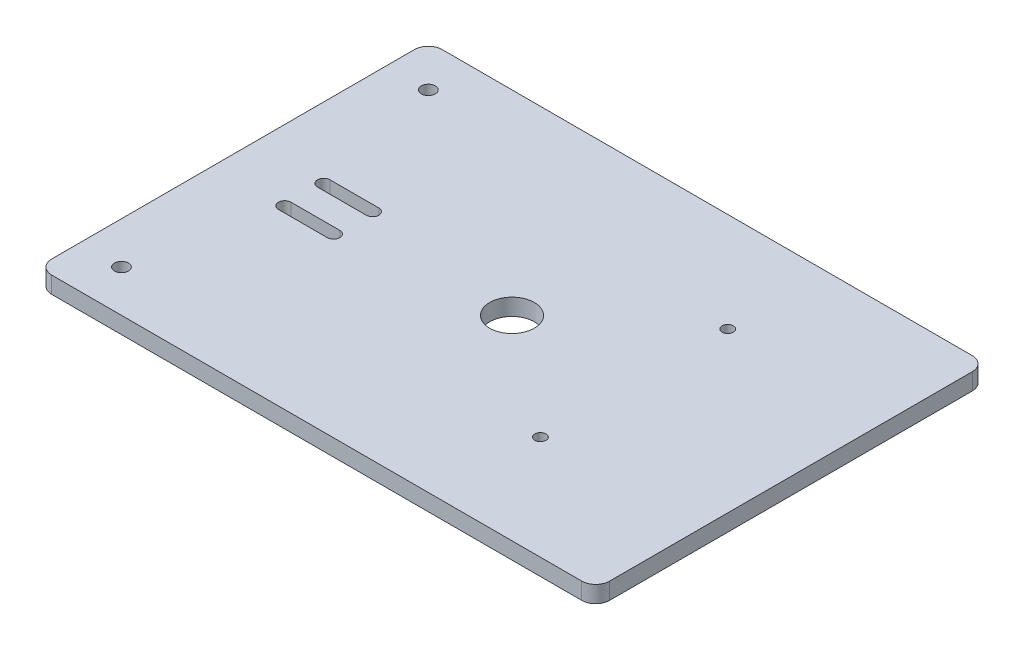
ISO-10303-21;
HEADER;
FILE_DESCRIPTION(('STEP AP214'),'2;1');
FILE_NAME('part.step','',(''),(''),'','','');
FILE_SCHEMA(('AUTOMOTIVE_DESIGN { 1 0 10303 214 1 1 1 1 }'));
ENDSEC;
DATA;
#1=APPLICATION_CONTEXT('core data for automotive mechanical design processes');
#2=APPLICATION_PROTOCOL_DEFINITION('international standard','automotive_design',2000,#1);
#3=PRODUCT_CONTEXT('',#1,'mechanical');
#4=PRODUCT('Part','Part','',(#3));
#5=PRODUCT_RELATED_PRODUCT_CATEGORY('part','',(#4));
#6=PRODUCT_DEFINITION_FORMATION('','',#4);
#7=PRODUCT_DEFINITION_CONTEXT('part definition',#1,'design');
#8=PRODUCT_DEFINITION('design','',#6,#7);
#9=PRODUCT_DEFINITION_SHAPE('','',#8);
#10=(LENGTH_UNIT() NAMED_UNIT(*) SI_UNIT(.MILLI.,.METRE.));
#11=(NAMED_UNIT(*) PLANE_ANGLE_UNIT() SI_UNIT($,.RADIAN.));
#12=(NAMED_UNIT(*) SI_UNIT($,.STERADIAN.) SOLID_ANGLE_UNIT());
#13=UNCERTAINTY_MEASURE_WITH_UNIT(LENGTH_MEASURE(1.E-05),#10,'distance_accuracy_value','');
#14=(GEOMETRIC_REPRESENTATION_CONTEXT(3) GLOBAL_UNCERTAINTY_ASSIGNED_CONTEXT((#13)) GLOBAL_UNIT_ASSIGNED_CONTEXT((#10,
#11,#12)) REPRESENTATION_CONTEXT('',''));
#15=CARTESIAN_POINT('',(0.,0.,0.));
#16=DIRECTION('',(0.,0.,1.));
#17=DIRECTION('',(1.,0.,0.));
#18=AXIS2_PLACEMENT_3D('',#15,#16,#17);
#19=CARTESIAN_POINT('',(100.,6.,-70.));
#20=DIRECTION('',(-1.,0.,0.));
#21=DIRECTION('',(0.,0.,1.));
#22=AXIS2_PLACEMENT_3D('',#19,#20,#21);
#23=PLANE('',#22);
#24=DIRECTION('',(0.,0.,-1.));
#25=VECTOR('',#24,1.);
#26=CARTESIAN_POINT('',(100.,0.,-70.));
#27=LINE('',#26,#25);
#28=CARTESIAN_POINT('',(100.,0.,65.));
#29=VERTEX_POINT('',#28);
#30=CARTESIAN_POINT('',(100.,0.,-65.));
#31=VERTEX_POINT('',#30);
#32=EDGE_CURVE('E234',#29,#31,#27,.T.);
#33=ORIENTED_EDGE('',*,*,#32,.T.);
#34=DIRECTION('',(0.,-1.,0.));
#35=VECTOR('',#34,1.);
#36=CARTESIAN_POINT('',(100.,6.,-65.));
#37=LINE('',#36,#35);
#38=CARTESIAN_POINT('',(100.,6.,-65.));
#39=VERTEX_POINT('',#38);
#40=EDGE_CURVE('E11',#31,#39,#37,.F.);
#41=ORIENTED_EDGE('',*,*,#40,.T.);
#42=DIRECTION('',(0.,0.,-1.));
#43=VECTOR('',#42,1.);
#44=CARTESIAN_POINT('',(100.,6.,-70.));
#45=LINE('',#44,#43);
#46=CARTESIAN_POINT('',(100.,6.,65.));
#47=VERTEX_POINT('',#46);
#48=EDGE_CURVE('E243',#47,#39,#45,.T.);
#49=ORIENTED_EDGE('',*,*,#48,.F.);
#50=DIRECTION('',(0.,-1.,0.));
#51=VECTOR('',#50,1.);
#52=CARTESIAN_POINT('',(100.,6.,65.));
#53=LINE('',#52,#51);
#54=EDGE_CURVE('E47',#47,#29,#53,.T.);
#55=ORIENTED_EDGE('',*,*,#54,.T.);
#56=EDGE_LOOP('',(#33,#41,#49,#55));
#57=FACE_BOUND('',#56,.T.);
#58=ADVANCED_FACE('F39',(#57),#23,.F.);
#59=CARTESIAN_POINT('',(-100.,6.,-70.));
#60=DIRECTION('',(0.,0.,1.));
#61=DIRECTION('',(1.,0.,0.));
#62=AXIS2_PLACEMENT_3D('',#59,#60,#61);
#63=PLANE('',#62);
#64=DIRECTION('',(-1.,0.,0.));
#65=VECTOR('',#64,1.);
#66=CARTESIAN_POINT('',(-100.,0.,-70.));
#67=LINE('',#66,#65);
#68=CARTESIAN_POINT('',(95.,0.,-70.));
#69=VERTEX_POINT('',#68);
#70=CARTESIAN_POINT('',(-95.,0.,-70.));
#71=VERTEX_POINT('',#70);
#72=EDGE_CURVE('E259',#69,#71,#67,.T.);
#73=ORIENTED_EDGE('',*,*,#72,.T.);
#74=DIRECTION('',(0.,-1.,0.));
#75=VECTOR('',#74,1.);
#76=CARTESIAN_POINT('',(-95.,6.,-70.));
#77=LINE('',#76,#75);
#78=CARTESIAN_POINT('',(-95.,6.,-70.));
#79=VERTEX_POINT('',#78);
#80=EDGE_CURVE('E282',#71,#79,#77,.F.);
#81=ORIENTED_EDGE('',*,*,#80,.T.);
#82=DIRECTION('',(-1.,0.,0.));
#83=VECTOR('',#82,1.);
#84=CARTESIAN_POINT('',(-100.,6.,-70.));
#85=LINE('',#84,#83);
#86=CARTESIAN_POINT('',(95.,6.,-70.));
#87=VERTEX_POINT('',#86);
#88=EDGE_CURVE('E246',#87,#79,#85,.T.);
#89=ORIENTED_EDGE('',*,*,#88,.F.);
#90=DIRECTION('',(0.,-1.,0.));
#91=VECTOR('',#90,1.);
#92=CARTESIAN_POINT('',(95.,6.,-70.));
#93=LINE('',#92,#91);
#94=EDGE_CURVE('E279',#87,#69,#93,.T.);
#95=ORIENTED_EDGE('',*,*,#94,.T.);
#96=EDGE_LOOP('',(#73,#81,#89,#95));
#97=FACE_BOUND('',#96,.T.);
#98=ADVANCED_FACE('F314',(#97),#63,.F.);
#99=CARTESIAN_POINT('',(-100.,6.,-70.));
#100=DIRECTION('',(1.,0.,0.));
#101=DIRECTION('',(0.,0.,-1.));
#102=AXIS2_PLACEMENT_3D('',#99,#100,#101);
#103=PLANE('',#102);
#104=DIRECTION('',(0.,0.,1.));
#105=VECTOR('',#104,1.);
#106=CARTESIAN_POINT('',(-100.,6.,-70.));
#107=LINE('',#106,#105);
#108=CARTESIAN_POINT('',(-100.,6.,-65.));
#109=VERTEX_POINT('',#108);
#110=CARTESIAN_POINT('',(-100.,6.,65.));
#111=VERTEX_POINT('',#110);
#112=EDGE_CURVE('E250',#109,#111,#107,.T.);
#113=ORIENTED_EDGE('',*,*,#112,.F.);
#114=DIRECTION('',(0.,-1.,0.));
#115=VECTOR('',#114,1.);
#116=CARTESIAN_POINT('',(-100.,6.,-65.));
#117=LINE('',#116,#115);
#118=CARTESIAN_POINT('',(-100.,0.,-65.));
#119=VERTEX_POINT('',#118);
#120=EDGE_CURVE('E268',#109,#119,#117,.T.);
#121=ORIENTED_EDGE('',*,*,#120,.T.);
#122=DIRECTION('',(0.,0.,1.));
#123=VECTOR('',#122,1.);
#124=CARTESIAN_POINT('',(-100.,0.,-70.));
#125=LINE('',#124,#123);
#126=CARTESIAN_POINT('',(-100.,0.,65.));
#127=VERTEX_POINT('',#126);
#128=EDGE_CURVE('E262',#119,#127,#125,.T.);
#129=ORIENTED_EDGE('',*,*,#128,.T.);
#130=DIRECTION('',(0.,-1.,0.));
#131=VECTOR('',#130,1.);
#132=CARTESIAN_POINT('',(-100.,6.,65.));
#133=LINE('',#132,#131);
#134=EDGE_CURVE('E256',#127,#111,#133,.F.);
#135=ORIENTED_EDGE('',*,*,#134,.T.);
#136=EDGE_LOOP('',(#113,#121,#129,#135));
#137=FACE_BOUND('',#136,.T.);
#138=ADVANCED_FACE('F324',(#137),#103,.F.);
#139=CARTESIAN_POINT('',(-100.,6.,70.));
#140=DIRECTION('',(0.,0.,-1.));
#141=DIRECTION('',(-1.,0.,0.));
#142=AXIS2_PLACEMENT_3D('',#139,#140,#141);
#143=PLANE('',#142);
#144=DIRECTION('',(1.,0.,0.));
#145=VECTOR('',#144,1.);
#146=CARTESIAN_POINT('',(-100.,6.,70.));
#147=LINE('',#146,#145);
#148=CARTESIAN_POINT('',(-95.,6.,70.));
#149=VERTEX_POINT('',#148);
#150=CARTESIAN_POINT('',(95.,6.,70.));
#151=VERTEX_POINT('',#150);
#152=EDGE_CURVE('E253',#149,#151,#147,.T.);
#153=ORIENTED_EDGE('',*,*,#152,.F.);
#154=DIRECTION('',(0.,-1.,0.));
#155=VECTOR('',#154,1.);
#156=CARTESIAN_POINT('',(-95.,6.,70.));
#157=LINE('',#156,#155);
#158=CARTESIAN_POINT('',(-95.,0.,70.));
#159=VERTEX_POINT('',#158);
#160=EDGE_CURVE('E294',#149,#159,#157,.T.);
#161=ORIENTED_EDGE('',*,*,#160,.T.);
#162=DIRECTION('',(1.,0.,0.));
#163=VECTOR('',#162,1.);
#164=CARTESIAN_POINT('',(-100.,0.,70.));
#165=LINE('',#164,#163);
#166=CARTESIAN_POINT('',(95.,0.,70.));
#167=VERTEX_POINT('',#166);
#168=EDGE_CURVE('E247',#159,#167,#165,.T.);
#169=ORIENTED_EDGE('',*,*,#168,.T.);
#170=DIRECTION('',(0.,-1.,0.));
#171=VECTOR('',#170,1.);
#172=CARTESIAN_POINT('',(95.,6.,70.));
#173=LINE('',#172,#171);
#174=EDGE_CURVE('E292',#167,#151,#173,.F.);
#175=ORIENTED_EDGE('',*,*,#174,.T.);
#176=EDGE_LOOP('',(#153,#161,#169,#175));
#177=FACE_BOUND('',#176,.T.);
#178=ADVANCED_FACE('F332',(#177),#143,.F.);
#179=CARTESIAN_POINT('',(0.,6.,0.));
#180=DIRECTION('',(0.,1.,0.));
#181=DIRECTION('',(0.,0.,1.));
#182=AXIS2_PLACEMENT_3D('',#179,#180,#181);
#183=PLANE('',#182);
#184=CARTESIAN_POINT('',(42.9026680620884,6.,32.7205206954273));
#185=DIRECTION('',(0.,1.,0.));
#186=DIRECTION('',(0.,0.,1.));
#187=AXIS2_PLACEMENT_3D('',#184,#185,#186);
#188=CIRCLE('',#187,2.);
#189=CARTESIAN_POINT('',(42.9026680620884,6.,34.7205206954273));
#190=VERTEX_POINT('',#189);
#191=EDGE_CURVE('E547',#190,#190,#188,.T.);
#192=ORIENTED_EDGE('',*,*,#191,.F.);
#193=EDGE_LOOP('',(#192));
#194=FACE_BOUND('',#193,.T.);
#195=CARTESIAN_POINT('',(42.9026680620884,6.,-34.4183434123503));
#196=DIRECTION('',(0.,1.,0.));
#197=DIRECTION('',(0.,0.,1.));
#198=AXIS2_PLACEMENT_3D('',#195,#196,#197);
#199=CIRCLE('',#198,2.);
#200=CARTESIAN_POINT('',(42.9026680620884,6.,-32.4183434123503));
#201=VERTEX_POINT('',#200);
#202=EDGE_CURVE('E545',#201,#201,#199,.T.);
#203=ORIENTED_EDGE('',*,*,#202,.F.);
#204=EDGE_LOOP('',(#203));
#205=FACE_BOUND('',#204,.T.);
#206=CARTESIAN_POINT('',(-74.6883733065754,6.,-7.21372475601388));
#207=DIRECTION('',(0.,1.,0.));
#208=DIRECTION('',(0.,0.,1.));
#209=AXIS2_PLACEMENT_3D('',#206,#207,#208);
#210=CIRCLE('',#209,2.25);
#211=CARTESIAN_POINT('',(-74.6883733065754,6.,-9.46372475601388));
#212=VERTEX_POINT('',#211);
#213=CARTESIAN_POINT('',(-74.6883733065754,6.,-4.96372475601388));
#214=VERTEX_POINT('',#213);
#215=EDGE_CURVE('E54',#212,#214,#210,.T.);
#216=ORIENTED_EDGE('',*,*,#215,.F.);
#217=DIRECTION('',(-1.,0.,0.));
#218=VECTOR('',#217,1.);
#219=CARTESIAN_POINT('',(-74.6883733065754,6.,-9.46372475601388));
#220=LINE('',#219,#218);
#221=CARTESIAN_POINT('',(-57.1883733065754,6.,-9.46372475601388));
#222=VERTEX_POINT('',#221);
#223=EDGE_CURVE('E172',#222,#212,#220,.T.);
#224=ORIENTED_EDGE('',*,*,#223,.F.);
#225=CARTESIAN_POINT('',(-57.1883733065754,6.,-7.21372475601388));
#226=DIRECTION('',(0.,1.,0.));
#227=DIRECTION('',(0.,0.,1.));
#228=AXIS2_PLACEMENT_3D('',#225,#226,#227);
#229=CIRCLE('',#228,2.25);
#230=CARTESIAN_POINT('',(-57.1883733065754,6.,-4.96372475601388));
#231=VERTEX_POINT('',#230);
#232=EDGE_CURVE('E175',#231,#222,#229,.T.);
#233=ORIENTED_EDGE('',*,*,#232,.F.);
#234=DIRECTION('',(1.,0.,0.));
#235=VECTOR('',#234,1.);
#236=CARTESIAN_POINT('',(-74.6883733065754,6.,-4.96372475601388));
#237=LINE('',#236,#235);
#238=EDGE_CURVE('E184',#214,#231,#237,.T.);
#239=ORIENTED_EDGE('',*,*,#238,.F.);
#240=EDGE_LOOP('',(#216,#224,#233,#239));
#241=FACE_BOUND('',#240,.T.);
#242=CARTESIAN_POINT('',(-74.7477276602054,6.,6.73692834937552));
#243=DIRECTION('',(0.,1.,0.));
#244=DIRECTION('',(0.,0.,1.));
#245=AXIS2_PLACEMENT_3D('',#242,#243,#244);
#246=CIRCLE('',#245,2.25);
#247=CARTESIAN_POINT('',(-74.7477276602054,6.,4.48692834937552));
#248=VERTEX_POINT('',#247);
#249=CARTESIAN_POINT('',(-74.7477276602054,6.,8.98692834937552));
#250=VERTEX_POINT('',#249);
#251=EDGE_CURVE('E62',#248,#250,#246,.T.);
#252=ORIENTED_EDGE('',*,*,#251,.F.);
#253=DIRECTION('',(-1.,0.,0.));
#254=VECTOR('',#253,1.);
#255=CARTESIAN_POINT('',(-74.7477276602054,6.,4.48692834937552));
#256=LINE('',#255,#254);
#257=CARTESIAN_POINT('',(-57.2477276602054,6.,4.48692834937552));
#258=VERTEX_POINT('',#257);
#259=EDGE_CURVE('E204',#258,#248,#256,.T.);
#260=ORIENTED_EDGE('',*,*,#259,.F.);
#261=CARTESIAN_POINT('',(-57.2477276602054,6.,6.73692834937552));
#262=DIRECTION('',(0.,1.,0.));
#263=DIRECTION('',(0.,0.,1.));
#264=AXIS2_PLACEMENT_3D('',#261,#262,#263);
#265=CIRCLE('',#264,2.25);
#266=CARTESIAN_POINT('',(-57.2477276602054,6.,8.98692834937552));
#267=VERTEX_POINT('',#266);
#268=EDGE_CURVE('E207',#267,#258,#265,.T.);
#269=ORIENTED_EDGE('',*,*,#268,.F.);
#270=DIRECTION('',(1.,0.,0.));
#271=VECTOR('',#270,1.);
#272=CARTESIAN_POINT('',(-74.7477276602054,6.,8.98692834937552));
#273=LINE('',#272,#271);
#274=EDGE_CURVE('E211',#250,#267,#273,.T.);
#275=ORIENTED_EDGE('',*,*,#274,.F.);
#276=EDGE_LOOP('',(#252,#260,#269,#275));
#277=FACE_BOUND('',#276,.T.);
#278=CARTESIAN_POINT('',(0.,6.,0.));
#279=DIRECTION('',(0.,1.,0.));
#280=DIRECTION('',(0.,0.,1.));
#281=AXIS2_PLACEMENT_3D('',#278,#279,#280);
#282=CIRCLE('',#281,8.);
#283=CARTESIAN_POINT('',(0.,6.,8.));
#284=VERTEX_POINT('',#283);
#285=EDGE_CURVE('E190',#284,#284,#282,.T.);
#286=ORIENTED_EDGE('',*,*,#285,.F.);
#287=EDGE_LOOP('',(#286));
#288=FACE_BOUND('',#287,.T.);
#289=CARTESIAN_POINT('',(-85.,6.,-55.));
#290=DIRECTION('',(0.,1.,0.));
#291=DIRECTION('',(0.,0.,1.));
#292=AXIS2_PLACEMENT_3D('',#289,#290,#291);
#293=CIRCLE('',#292,2.5);
#294=CARTESIAN_POINT('',(-85.,6.,-52.5));
#295=VERTEX_POINT('',#294);
#296=EDGE_CURVE('E235',#295,#295,#293,.T.);
#297=ORIENTED_EDGE('',*,*,#296,.F.);
#298=EDGE_LOOP('',(#297));
#299=FACE_BOUND('',#298,.T.);
#300=CARTESIAN_POINT('',(-85.,6.,55.));
#301=DIRECTION('',(0.,1.,0.));
#302=DIRECTION('',(0.,0.,-1.));
#303=AXIS2_PLACEMENT_3D('',#300,#301,#302);
#304=CIRCLE('',#303,2.5);
#305=CARTESIAN_POINT('',(-85.,6.,52.5));
#306=VERTEX_POINT('',#305);
#307=EDGE_CURVE('E238',#306,#306,#304,.T.);
#308=ORIENTED_EDGE('',*,*,#307,.F.);
#309=EDGE_LOOP('',(#308));
#310=FACE_BOUND('',#309,.T.);
#311=ORIENTED_EDGE('',*,*,#88,.T.);
#312=CARTESIAN_POINT('',(-95.,6.,-65.));
#313=DIRECTION('',(0.,1.,0.));
#314=DIRECTION('',(0.,0.,1.));
#315=AXIS2_PLACEMENT_3D('',#312,#313,#314);
#316=CIRCLE('',#315,5.);
#317=EDGE_CURVE('E290',#79,#109,#316,.T.);
#318=ORIENTED_EDGE('',*,*,#317,.T.);
#319=ORIENTED_EDGE('',*,*,#112,.T.);
#320=CARTESIAN_POINT('',(-95.,6.,65.));
#321=DIRECTION('',(0.,1.,0.));
#322=DIRECTION('',(0.,0.,1.));
#323=AXIS2_PLACEMENT_3D('',#320,#321,#322);
#324=CIRCLE('',#323,5.);
#325=EDGE_CURVE('E288',#111,#149,#324,.T.);
#326=ORIENTED_EDGE('',*,*,#325,.T.);
#327=ORIENTED_EDGE('',*,*,#152,.T.);
#328=CARTESIAN_POINT('',(95.,6.,65.));
#329=DIRECTION('',(0.,1.,0.));
#330=DIRECTION('',(0.,0.,1.));
#331=AXIS2_PLACEMENT_3D('',#328,#329,#330);
#332=CIRCLE('',#331,5.);
#333=EDGE_CURVE('E284',#151,#47,#332,.T.);
#334=ORIENTED_EDGE('',*,*,#333,.T.);
#335=ORIENTED_EDGE('',*,*,#48,.T.);
#336=CARTESIAN_POINT('',(95.,6.,-65.));
#337=DIRECTION('',(0.,1.,0.));
#338=DIRECTION('',(0.,0.,1.));
#339=AXIS2_PLACEMENT_3D('',#336,#337,#338);
#340=CIRCLE('',#339,5.);
#341=EDGE_CURVE('E286',#39,#87,#340,.T.);
#342=ORIENTED_EDGE('',*,*,#341,.T.);
#343=EDGE_LOOP('',(#311,#318,#319,#326,#327,#334,#335,#342));
#344=FACE_BOUND('',#343,.T.);
#345=ADVANCED_FACE('F318',(#194,#205,#241,#277,#288,#299,#310,#344),#183,.T.);
#346=CARTESIAN_POINT('',(0.,0.,0.));
#347=DIRECTION('',(0.,1.,0.));
#348=DIRECTION('',(0.,0.,1.));
#349=AXIS2_PLACEMENT_3D('',#346,#347,#348);
#350=PLANE('',#349);
#351=CARTESIAN_POINT('',(42.9026680620884,0.,32.7205206954273));
#352=DIRECTION('',(0.,1.,0.));
#353=DIRECTION('',(0.,0.,1.));
#354=AXIS2_PLACEMENT_3D('',#351,#352,#353);
#355=CIRCLE('',#354,2.);
#356=CARTESIAN_POINT('',(42.9026680620884,0.,34.7205206954273));
#357=VERTEX_POINT('',#356);
#358=EDGE_CURVE('E203',#357,#357,#355,.T.);
#359=ORIENTED_EDGE('',*,*,#358,.T.);
#360=EDGE_LOOP('',(#359));
#361=FACE_BOUND('',#360,.T.);
#362=CARTESIAN_POINT('',(42.9026680620884,0.,-34.4183434123503));
#363=DIRECTION('',(0.,1.,0.));
#364=DIRECTION('',(0.,0.,1.));
#365=AXIS2_PLACEMENT_3D('',#362,#363,#364);
#366=CIRCLE('',#365,2.);
#367=CARTESIAN_POINT('',(42.9026680620884,0.,-32.4183434123503));
#368=VERTEX_POINT('',#367);
#369=EDGE_CURVE('E178',#368,#368,#366,.T.);
#370=ORIENTED_EDGE('',*,*,#369,.T.);
#371=EDGE_LOOP('',(#370));
#372=FACE_BOUND('',#371,.T.);
#373=DIRECTION('',(-1.,0.,0.));
#374=VECTOR('',#373,1.);
#375=CARTESIAN_POINT('',(-74.6883733065754,0.,-9.46372475601388));
#376=LINE('',#375,#374);
#377=CARTESIAN_POINT('',(-57.1883733065754,0.,-9.46372475601388));
#378=VERTEX_POINT('',#377);
#379=CARTESIAN_POINT('',(-74.6883733065754,0.,-9.46372475601388));
#380=VERTEX_POINT('',#379);
#381=EDGE_CURVE('E159',#378,#380,#376,.T.);
#382=ORIENTED_EDGE('',*,*,#381,.T.);
#383=CARTESIAN_POINT('',(-74.6883733065754,0.,-7.21372475601388));
#384=DIRECTION('',(0.,1.,0.));
#385=DIRECTION('',(0.,0.,1.));
#386=AXIS2_PLACEMENT_3D('',#383,#384,#385);
#387=CIRCLE('',#386,2.25);
#388=CARTESIAN_POINT('',(-74.6883733065754,0.,-4.96372475601388));
#389=VERTEX_POINT('',#388);
#390=EDGE_CURVE('E153',#380,#389,#387,.T.);
#391=ORIENTED_EDGE('',*,*,#390,.T.);
#392=DIRECTION('',(1.,0.,0.));
#393=VECTOR('',#392,1.);
#394=CARTESIAN_POINT('',(-74.6883733065754,0.,-4.96372475601388));
#395=LINE('',#394,#393);
#396=CARTESIAN_POINT('',(-57.1883733065754,0.,-4.96372475601388));
#397=VERTEX_POINT('',#396);
#398=EDGE_CURVE('E163',#389,#397,#395,.T.);
#399=ORIENTED_EDGE('',*,*,#398,.T.);
#400=CARTESIAN_POINT('',(-57.1883733065754,0.,-7.21372475601388));
#401=DIRECTION('',(0.,1.,0.));
#402=DIRECTION('',(0.,0.,1.));
#403=AXIS2_PLACEMENT_3D('',#400,#401,#402);
#404=CIRCLE('',#403,2.25);
#405=EDGE_CURVE('E167',#397,#378,#404,.T.);
#406=ORIENTED_EDGE('',*,*,#405,.T.);
#407=EDGE_LOOP('',(#382,#391,#399,#406));
#408=FACE_BOUND('',#407,.T.);
#409=DIRECTION('',(-1.,0.,0.));
#410=VECTOR('',#409,1.);
#411=CARTESIAN_POINT('',(-74.7477276602054,0.,4.48692834937552));
#412=LINE('',#411,#410);
#413=CARTESIAN_POINT('',(-57.2477276602054,0.,4.48692834937552));
#414=VERTEX_POINT('',#413);
#415=CARTESIAN_POINT('',(-74.7477276602054,0.,4.48692834937552));
#416=VERTEX_POINT('',#415);
#417=EDGE_CURVE('E196',#414,#416,#412,.T.);
#418=ORIENTED_EDGE('',*,*,#417,.T.);
#419=CARTESIAN_POINT('',(-74.7477276602054,0.,6.73692834937552));
#420=DIRECTION('',(0.,1.,0.));
#421=DIRECTION('',(0.,0.,1.));
#422=AXIS2_PLACEMENT_3D('',#419,#420,#421);
#423=CIRCLE('',#422,2.25);
#424=CARTESIAN_POINT('',(-74.7477276602054,0.,8.98692834937552));
#425=VERTEX_POINT('',#424);
#426=EDGE_CURVE('E208',#416,#425,#423,.T.);
#427=ORIENTED_EDGE('',*,*,#426,.T.);
#428=DIRECTION('',(1.,0.,0.));
#429=VECTOR('',#428,1.);
#430=CARTESIAN_POINT('',(-74.7477276602054,0.,8.98692834937552));
#431=LINE('',#430,#429);
#432=CARTESIAN_POINT('',(-57.2477276602054,0.,8.98692834937552));
#433=VERTEX_POINT('',#432);
#434=EDGE_CURVE('E220',#425,#433,#431,.T.);
#435=ORIENTED_EDGE('',*,*,#434,.T.);
#436=CARTESIAN_POINT('',(-57.2477276602054,0.,6.73692834937552));
#437=DIRECTION('',(0.,1.,0.));
#438=DIRECTION('',(0.,0.,1.));
#439=AXIS2_PLACEMENT_3D('',#436,#437,#438);
#440=CIRCLE('',#439,2.25);
#441=EDGE_CURVE('E217',#433,#414,#440,.T.);
#442=ORIENTED_EDGE('',*,*,#441,.T.);
#443=EDGE_LOOP('',(#418,#427,#435,#442));
#444=FACE_BOUND('',#443,.T.);
#445=CARTESIAN_POINT('',(0.,0.,0.));
#446=DIRECTION('',(0.,1.,0.));
#447=DIRECTION('',(0.,0.,1.));
#448=AXIS2_PLACEMENT_3D('',#445,#446,#447);
#449=CIRCLE('',#448,8.);
#450=CARTESIAN_POINT('',(0.,0.,8.));
#451=VERTEX_POINT('',#450);
#452=EDGE_CURVE('E225',#451,#451,#449,.T.);
#453=ORIENTED_EDGE('',*,*,#452,.T.);
#454=EDGE_LOOP('',(#453));
#455=FACE_BOUND('',#454,.T.);
#456=CARTESIAN_POINT('',(-85.,0.,-55.));
#457=DIRECTION('',(0.,1.,0.));
#458=DIRECTION('',(0.,0.,1.));
#459=AXIS2_PLACEMENT_3D('',#456,#457,#458);
#460=CIRCLE('',#459,2.5);
#461=CARTESIAN_POINT('',(-85.,0.,-52.5));
#462=VERTEX_POINT('',#461);
#463=EDGE_CURVE('E231',#462,#462,#460,.T.);
#464=ORIENTED_EDGE('',*,*,#463,.T.);
#465=EDGE_LOOP('',(#464));
#466=FACE_BOUND('',#465,.T.);
#467=CARTESIAN_POINT('',(-85.,0.,55.));
#468=DIRECTION('',(0.,1.,0.));
#469=DIRECTION('',(0.,0.,-1.));
#470=AXIS2_PLACEMENT_3D('',#467,#468,#469);
#471=CIRCLE('',#470,2.5);
#472=CARTESIAN_POINT('',(-85.,0.,52.5));
#473=VERTEX_POINT('',#472);
#474=EDGE_CURVE('E228',#473,#473,#471,.T.);
#475=ORIENTED_EDGE('',*,*,#474,.T.);
#476=EDGE_LOOP('',(#475));
#477=FACE_BOUND('',#476,.T.);
#478=ORIENTED_EDGE('',*,*,#128,.F.);
#479=CARTESIAN_POINT('',(-95.,0.,-65.));
#480=DIRECTION('',(0.,1.,0.));
#481=DIRECTION('',(0.,0.,1.));
#482=AXIS2_PLACEMENT_3D('',#479,#480,#481);
#483=CIRCLE('',#482,5.);
#484=EDGE_CURVE('E277',#119,#71,#483,.F.);
#485=ORIENTED_EDGE('',*,*,#484,.T.);
#486=ORIENTED_EDGE('',*,*,#72,.F.);
#487=CARTESIAN_POINT('',(95.,0.,-65.));
#488=DIRECTION('',(0.,1.,0.));
#489=DIRECTION('',(0.,0.,1.));
#490=AXIS2_PLACEMENT_3D('',#487,#488,#489);
#491=CIRCLE('',#490,5.);
#492=EDGE_CURVE('E273',#69,#31,#491,.F.);
#493=ORIENTED_EDGE('',*,*,#492,.T.);
#494=ORIENTED_EDGE('',*,*,#32,.F.);
#495=CARTESIAN_POINT('',(95.,0.,65.));
#496=DIRECTION('',(0.,1.,0.));
#497=DIRECTION('',(0.,0.,1.));
#498=AXIS2_PLACEMENT_3D('',#495,#496,#497);
#499=CIRCLE('',#498,5.);
#500=EDGE_CURVE('E271',#29,#167,#499,.F.);
#501=ORIENTED_EDGE('',*,*,#500,.T.);
#502=ORIENTED_EDGE('',*,*,#168,.F.);
#503=CARTESIAN_POINT('',(-95.,0.,65.));
#504=DIRECTION('',(0.,1.,0.));
#505=DIRECTION('',(0.,0.,1.));
#506=AXIS2_PLACEMENT_3D('',#503,#504,#505);
#507=CIRCLE('',#506,5.);
#508=EDGE_CURVE('E275',#159,#127,#507,.F.);
#509=ORIENTED_EDGE('',*,*,#508,.T.);
#510=EDGE_LOOP('',(#478,#485,#486,#493,#494,#501,#502,#509));
#511=FACE_BOUND('',#510,.T.);
#512=ADVANCED_FACE('F169',(#361,#372,#408,#444,#455,#466,#477,#511),#350,.F.);
#513=CARTESIAN_POINT('',(-95.,6.,-65.));
#514=DIRECTION('',(0.,-1.,0.));
#515=DIRECTION('',(0.,0.,-1.));
#516=AXIS2_PLACEMENT_3D('',#513,#514,#515);
#517=CYLINDRICAL_SURFACE('',#516,5.);
#518=ORIENTED_EDGE('',*,*,#317,.F.);
#519=ORIENTED_EDGE('',*,*,#80,.F.);
#520=ORIENTED_EDGE('',*,*,#484,.F.);
#521=ORIENTED_EDGE('',*,*,#120,.F.);
#522=EDGE_LOOP('',(#518,#519,#520,#521));
#523=FACE_BOUND('',#522,.T.);
#524=ADVANCED_FACE('F322',(#523),#517,.T.);
#525=CARTESIAN_POINT('',(-95.,6.,65.));
#526=DIRECTION('',(0.,-1.,0.));
#527=DIRECTION('',(0.,0.,-1.));
#528=AXIS2_PLACEMENT_3D('',#525,#526,#527);
#529=CYLINDRICAL_SURFACE('',#528,5.);
#530=ORIENTED_EDGE('',*,*,#325,.F.);
#531=ORIENTED_EDGE('',*,*,#134,.F.);
#532=ORIENTED_EDGE('',*,*,#508,.F.);
#533=ORIENTED_EDGE('',*,*,#160,.F.);
#534=EDGE_LOOP('',(#530,#531,#532,#533));
#535=FACE_BOUND('',#534,.T.);
#536=ADVANCED_FACE('F329',(#535),#529,.T.);
#537=CARTESIAN_POINT('',(95.,6.,-65.));
#538=DIRECTION('',(0.,-1.,0.));
#539=DIRECTION('',(0.,0.,-1.));
#540=AXIS2_PLACEMENT_3D('',#537,#538,#539);
#541=CYLINDRICAL_SURFACE('',#540,5.);
#542=ORIENTED_EDGE('',*,*,#341,.F.);
#543=ORIENTED_EDGE('',*,*,#40,.F.);
#544=ORIENTED_EDGE('',*,*,#492,.F.);
#545=ORIENTED_EDGE('',*,*,#94,.F.);
#546=EDGE_LOOP('',(#542,#543,#544,#545));
#547=FACE_BOUND('',#546,.T.);
#548=ADVANCED_FACE('F311',(#547),#541,.T.);
#549=CARTESIAN_POINT('',(95.,6.,65.));
#550=DIRECTION('',(0.,-1.,0.));
#551=DIRECTION('',(0.,0.,-1.));
#552=AXIS2_PLACEMENT_3D('',#549,#550,#551);
#553=CYLINDRICAL_SURFACE('',#552,5.);
#554=ORIENTED_EDGE('',*,*,#333,.F.);
#555=ORIENTED_EDGE('',*,*,#174,.F.);
#556=ORIENTED_EDGE('',*,*,#500,.F.);
#557=ORIENTED_EDGE('',*,*,#54,.F.);
#558=EDGE_LOOP('',(#554,#555,#556,#557));
#559=FACE_BOUND('',#558,.T.);
#560=ADVANCED_FACE('F41',(#559),#553,.T.);
#561=CARTESIAN_POINT('',(-85.,0.,55.));
#562=DIRECTION('',(0.,1.,0.));
#563=DIRECTION('',(0.,0.,1.));
#564=AXIS2_PLACEMENT_3D('',#561,#562,#563);
#565=CYLINDRICAL_SURFACE('',#564,2.5);
#566=ORIENTED_EDGE('',*,*,#474,.F.);
#567=EDGE_LOOP('',(#566));
#568=FACE_BOUND('',#567,.T.);
#569=ORIENTED_EDGE('',*,*,#307,.T.);
#570=EDGE_LOOP('',(#569));
#571=FACE_BOUND('',#570,.T.);
#572=ADVANCED_FACE('F335',(#568,#571),#565,.F.);
#573=CARTESIAN_POINT('',(-85.,0.,-55.));
#574=DIRECTION('',(0.,1.,0.));
#575=DIRECTION('',(0.,0.,1.));
#576=AXIS2_PLACEMENT_3D('',#573,#574,#575);
#577=CYLINDRICAL_SURFACE('',#576,2.5);
#578=ORIENTED_EDGE('',*,*,#463,.F.);
#579=EDGE_LOOP('',(#578));
#580=FACE_BOUND('',#579,.T.);
#581=ORIENTED_EDGE('',*,*,#296,.T.);
#582=EDGE_LOOP('',(#581));
#583=FACE_BOUND('',#582,.T.);
#584=ADVANCED_FACE('F340',(#580,#583),#577,.F.);
#585=CARTESIAN_POINT('',(0.,0.,0.));
#586=DIRECTION('',(0.,1.,0.));
#587=DIRECTION('',(0.,0.,1.));
#588=AXIS2_PLACEMENT_3D('',#585,#586,#587);
#589=CYLINDRICAL_SURFACE('',#588,8.);
#590=ORIENTED_EDGE('',*,*,#452,.F.);
#591=EDGE_LOOP('',(#590));
#592=FACE_BOUND('',#591,.T.);
#593=ORIENTED_EDGE('',*,*,#285,.T.);
#594=EDGE_LOOP('',(#593));
#595=FACE_BOUND('',#594,.T.);
#596=ADVANCED_FACE('F384',(#592,#595),#589,.F.);
#597=CARTESIAN_POINT('',(-74.7477276602054,0.,6.73692834937552));
#598=DIRECTION('',(0.,1.,0.));
#599=DIRECTION('',(0.,0.,1.));
#600=AXIS2_PLACEMENT_3D('',#597,#598,#599);
#601=CYLINDRICAL_SURFACE('',#600,2.25);
#602=ORIENTED_EDGE('',*,*,#251,.T.);
#603=DIRECTION('',(0.,1.,0.));
#604=VECTOR('',#603,1.);
#605=CARTESIAN_POINT('',(-74.7477276602054,0.,8.98692834937552));
#606=LINE('',#605,#604);
#607=EDGE_CURVE('E194',#425,#250,#606,.T.);
#608=ORIENTED_EDGE('',*,*,#607,.F.);
#609=ORIENTED_EDGE('',*,*,#426,.F.);
#610=DIRECTION('',(0.,1.,0.));
#611=VECTOR('',#610,1.);
#612=CARTESIAN_POINT('',(-74.7477276602054,0.,4.48692834937552));
#613=LINE('',#612,#611);
#614=EDGE_CURVE('E201',#416,#248,#613,.T.);
#615=ORIENTED_EDGE('',*,*,#614,.T.);
#616=EDGE_LOOP('',(#602,#608,#609,#615));
#617=FACE_BOUND('',#616,.T.);
#618=ADVANCED_FACE('F394',(#617),#601,.F.);
#619=CARTESIAN_POINT('',(-74.7477276602054,0.,4.48692834937552));
#620=DIRECTION('',(0.,0.,-1.));
#621=DIRECTION('',(-1.,0.,0.));
#622=AXIS2_PLACEMENT_3D('',#619,#620,#621);
#623=PLANE('',#622);
#624=ORIENTED_EDGE('',*,*,#259,.T.);
#625=ORIENTED_EDGE('',*,*,#614,.F.);
#626=ORIENTED_EDGE('',*,*,#417,.F.);
#627=DIRECTION('',(0.,1.,0.));
#628=VECTOR('',#627,1.);
#629=CARTESIAN_POINT('',(-57.2477276602054,0.,4.48692834937552));
#630=LINE('',#629,#628);
#631=EDGE_CURVE('E199',#414,#258,#630,.T.);
#632=ORIENTED_EDGE('',*,*,#631,.T.);
#633=EDGE_LOOP('',(#624,#625,#626,#632));
#634=FACE_BOUND('',#633,.T.);
#635=ADVANCED_FACE('F404',(#634),#623,.F.);
#636=CARTESIAN_POINT('',(-57.2477276602054,0.,6.73692834937552));
#637=DIRECTION('',(0.,1.,0.));
#638=DIRECTION('',(0.,0.,1.));
#639=AXIS2_PLACEMENT_3D('',#636,#637,#638);
#640=CYLINDRICAL_SURFACE('',#639,2.25);
#641=ORIENTED_EDGE('',*,*,#268,.T.);
#642=ORIENTED_EDGE('',*,*,#631,.F.);
#643=ORIENTED_EDGE('',*,*,#441,.F.);
#644=DIRECTION('',(0.,1.,0.));
#645=VECTOR('',#644,1.);
#646=CARTESIAN_POINT('',(-57.2477276602054,0.,8.98692834937552));
#647=LINE('',#646,#645);
#648=EDGE_CURVE('E197',#433,#267,#647,.T.);
#649=ORIENTED_EDGE('',*,*,#648,.T.);
#650=EDGE_LOOP('',(#641,#642,#643,#649));
#651=FACE_BOUND('',#650,.T.);
#652=ADVANCED_FACE('F413',(#651),#640,.F.);
#653=CARTESIAN_POINT('',(-74.7477276602054,0.,8.98692834937552));
#654=DIRECTION('',(0.,0.,1.));
#655=DIRECTION('',(1.,0.,0.));
#656=AXIS2_PLACEMENT_3D('',#653,#654,#655);
#657=PLANE('',#656);
#658=ORIENTED_EDGE('',*,*,#274,.T.);
#659=ORIENTED_EDGE('',*,*,#648,.F.);
#660=ORIENTED_EDGE('',*,*,#434,.F.);
#661=ORIENTED_EDGE('',*,*,#607,.T.);
#662=EDGE_LOOP('',(#658,#659,#660,#661));
#663=FACE_BOUND('',#662,.T.);
#664=ADVANCED_FACE('F423',(#663),#657,.F.);
#665=CARTESIAN_POINT('',(-74.6883733065754,0.,-7.21372475601388));
#666=DIRECTION('',(0.,1.,0.));
#667=DIRECTION('',(0.,0.,1.));
#668=AXIS2_PLACEMENT_3D('',#665,#666,#667);
#669=CYLINDRICAL_SURFACE('',#668,2.25);
#670=ORIENTED_EDGE('',*,*,#215,.T.);
#671=DIRECTION('',(0.,1.,0.));
#672=VECTOR('',#671,1.);
#673=CARTESIAN_POINT('',(-74.6883733065754,0.,-4.96372475601388));
#674=LINE('',#673,#672);
#675=EDGE_CURVE('E149',#389,#214,#674,.T.);
#676=ORIENTED_EDGE('',*,*,#675,.F.);
#677=ORIENTED_EDGE('',*,*,#390,.F.);
#678=DIRECTION('',(0.,1.,0.));
#679=VECTOR('',#678,1.);
#680=CARTESIAN_POINT('',(-74.6883733065754,0.,-9.46372475601388));
#681=LINE('',#680,#679);
#682=EDGE_CURVE('E188',#380,#212,#681,.T.);
#683=ORIENTED_EDGE('',*,*,#682,.T.);
#684=EDGE_LOOP('',(#670,#676,#677,#683));
#685=FACE_BOUND('',#684,.T.);
#686=ADVANCED_FACE('F151',(#685),#669,.F.);
#687=CARTESIAN_POINT('',(-74.6883733065754,0.,-9.46372475601388));
#688=DIRECTION('',(0.,0.,-1.));
#689=DIRECTION('',(-1.,0.,0.));
#690=AXIS2_PLACEMENT_3D('',#687,#688,#689);
#691=PLANE('',#690);
#692=ORIENTED_EDGE('',*,*,#223,.T.);
#693=ORIENTED_EDGE('',*,*,#682,.F.);
#694=ORIENTED_EDGE('',*,*,#381,.F.);
#695=DIRECTION('',(0.,1.,0.));
#696=VECTOR('',#695,1.);
#697=CARTESIAN_POINT('',(-57.1883733065754,0.,-9.46372475601388));
#698=LINE('',#697,#696);
#699=EDGE_CURVE('E191',#378,#222,#698,.T.);
#700=ORIENTED_EDGE('',*,*,#699,.T.);
#701=EDGE_LOOP('',(#692,#693,#694,#700));
#702=FACE_BOUND('',#701,.T.);
#703=ADVANCED_FACE('F442',(#702),#691,.F.);
#704=CARTESIAN_POINT('',(-57.1883733065754,0.,-7.21372475601388));
#705=DIRECTION('',(0.,1.,0.));
#706=DIRECTION('',(0.,0.,1.));
#707=AXIS2_PLACEMENT_3D('',#704,#705,#706);
#708=CYLINDRICAL_SURFACE('',#707,2.25);
#709=ORIENTED_EDGE('',*,*,#232,.T.);
#710=ORIENTED_EDGE('',*,*,#699,.F.);
#711=ORIENTED_EDGE('',*,*,#405,.F.);
#712=DIRECTION('',(0.,1.,0.));
#713=VECTOR('',#712,1.);
#714=CARTESIAN_POINT('',(-57.1883733065754,0.,-4.96372475601388));
#715=LINE('',#714,#713);
#716=EDGE_CURVE('E158',#397,#231,#715,.T.);
#717=ORIENTED_EDGE('',*,*,#716,.T.);
#718=EDGE_LOOP('',(#709,#710,#711,#717));
#719=FACE_BOUND('',#718,.T.);
#720=ADVANCED_FACE('F451',(#719),#708,.F.);
#721=CARTESIAN_POINT('',(-74.6883733065754,0.,-4.96372475601388));
#722=DIRECTION('',(0.,0.,1.));
#723=DIRECTION('',(1.,0.,0.));
#724=AXIS2_PLACEMENT_3D('',#721,#722,#723);
#725=PLANE('',#724);
#726=ORIENTED_EDGE('',*,*,#238,.T.);
#727=ORIENTED_EDGE('',*,*,#716,.F.);
#728=ORIENTED_EDGE('',*,*,#398,.F.);
#729=ORIENTED_EDGE('',*,*,#675,.T.);
#730=EDGE_LOOP('',(#726,#727,#728,#729));
#731=FACE_BOUND('',#730,.T.);
#732=ADVANCED_FACE('F164',(#731),#725,.F.);
#733=CARTESIAN_POINT('',(42.9026680620884,0.,-34.4183434123503));
#734=DIRECTION('',(0.,1.,0.));
#735=DIRECTION('',(0.,0.,1.));
#736=AXIS2_PLACEMENT_3D('',#733,#734,#735);
#737=CYLINDRICAL_SURFACE('',#736,2.);
#738=ORIENTED_EDGE('',*,*,#369,.F.);
#739=EDGE_LOOP('',(#738));
#740=FACE_BOUND('',#739,.T.);
#741=ORIENTED_EDGE('',*,*,#202,.T.);
#742=EDGE_LOOP('',(#741));
#743=FACE_BOUND('',#742,.T.);
#744=ADVANCED_FACE('F470',(#740,#743),#737,.F.);
#745=CARTESIAN_POINT('',(42.9026680620884,0.,32.7205206954273));
#746=DIRECTION('',(0.,1.,0.));
#747=DIRECTION('',(0.,0.,1.));
#748=AXIS2_PLACEMENT_3D('',#745,#746,#747);
#749=CYLINDRICAL_SURFACE('',#748,2.);
#750=ORIENTED_EDGE('',*,*,#358,.F.);
#751=EDGE_LOOP('',(#750));
#752=FACE_BOUND('',#751,.T.);
#753=ORIENTED_EDGE('',*,*,#191,.T.);
#754=EDGE_LOOP('',(#753));
#755=FACE_BOUND('',#754,.T.);
#756=ADVANCED_FACE('F480',(#752,#755),#749,.F.);
#757=CLOSED_SHELL('',(#58,#98,#138,#178,#345,#512,#524,#536,#548,#560,#572,#584,#596,#618,#635,
#652,#664,#686,#703,#720,#732,#744,#756));
#758=MANIFOLD_SOLID_BREP('B2',#757);
#759=ADVANCED_BREP_SHAPE_REPRESENTATION('',(#18,#758),#14);
#760=SHAPE_DEFINITION_REPRESENTATION(#9,#759);
ENDSEC;
END-ISO-10303-21;
